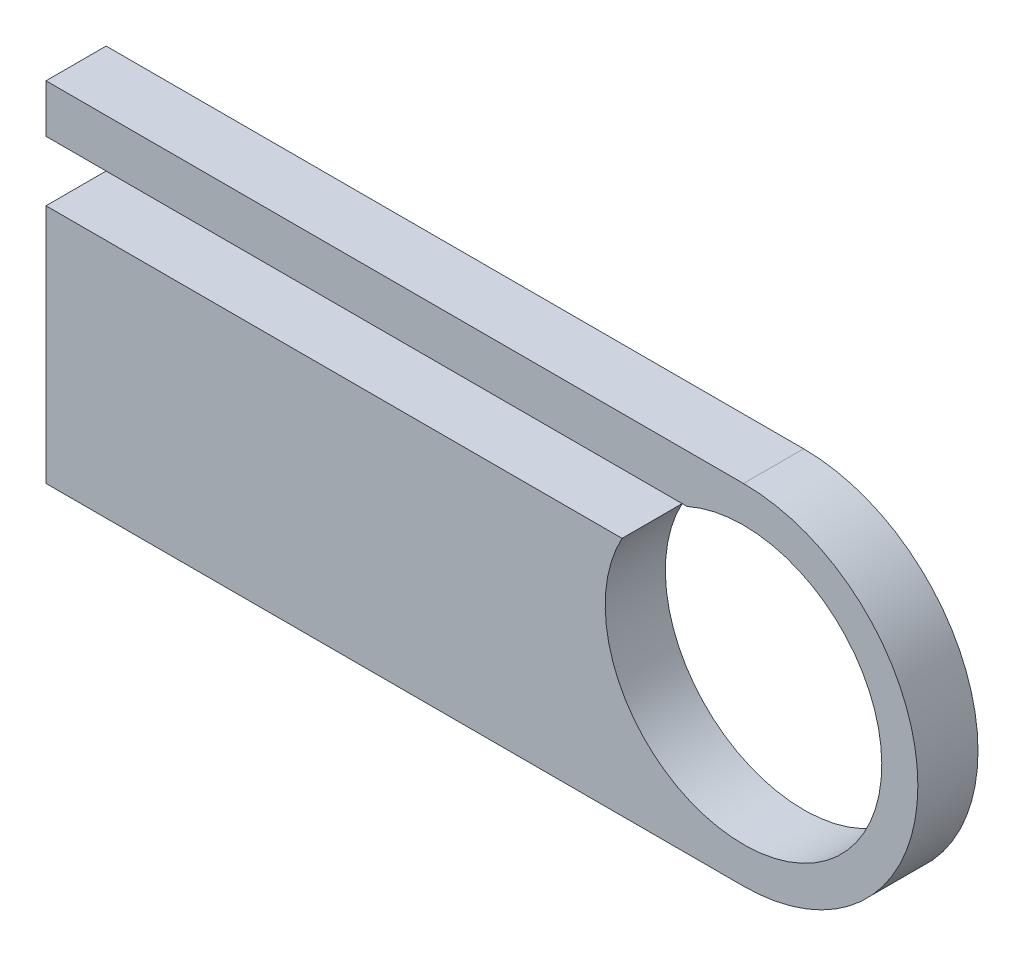
ISO-10303-21;
HEADER;
FILE_DESCRIPTION(('STEP AP214'),'2;1');
FILE_NAME('part.step','',(''),(''),'','','');
FILE_SCHEMA(('AUTOMOTIVE_DESIGN { 1 0 10303 214 1 1 1 1 }'));
ENDSEC;
DATA;
#1=APPLICATION_CONTEXT('core data for automotive mechanical design processes');
#2=APPLICATION_PROTOCOL_DEFINITION('international standard','automotive_design',2000,#1);
#3=PRODUCT_CONTEXT('',#1,'mechanical');
#4=PRODUCT('Part','Part','',(#3));
#5=PRODUCT_RELATED_PRODUCT_CATEGORY('part','',(#4));
#6=PRODUCT_DEFINITION_FORMATION('','',#4);
#7=PRODUCT_DEFINITION_CONTEXT('part definition',#1,'design');
#8=PRODUCT_DEFINITION('design','',#6,#7);
#9=PRODUCT_DEFINITION_SHAPE('','',#8);
#10=(LENGTH_UNIT() NAMED_UNIT(*) SI_UNIT(.MILLI.,.METRE.));
#11=(NAMED_UNIT(*) PLANE_ANGLE_UNIT() SI_UNIT($,.RADIAN.));
#12=(NAMED_UNIT(*) SI_UNIT($,.STERADIAN.) SOLID_ANGLE_UNIT());
#13=UNCERTAINTY_MEASURE_WITH_UNIT(LENGTH_MEASURE(1.E-05),#10,'distance_accuracy_value','');
#14=(GEOMETRIC_REPRESENTATION_CONTEXT(3) GLOBAL_UNCERTAINTY_ASSIGNED_CONTEXT((#13)) GLOBAL_UNIT_ASSIGNED_CONTEXT((#10,
#11,#12)) REPRESENTATION_CONTEXT('',''));
#15=CARTESIAN_POINT('',(0.,0.,0.));
#16=DIRECTION('',(0.,0.,1.));
#17=DIRECTION('',(1.,0.,0.));
#18=AXIS2_PLACEMENT_3D('',#15,#16,#17);
#19=CARTESIAN_POINT('',(0.,0.,5.));
#20=DIRECTION('',(0.,1.,0.));
#21=DIRECTION('',(0.,0.,1.));
#22=AXIS2_PLACEMENT_3D('',#19,#20,#21);
#23=PLANE('',#22);
#24=DIRECTION('',(1.,0.,0.));
#25=VECTOR('',#24,1.);
#26=CARTESIAN_POINT('',(0.,0.,0.));
#27=LINE('',#26,#25);
#28=CARTESIAN_POINT('',(0.,0.,0.));
#29=VERTEX_POINT('',#28);
#30=CARTESIAN_POINT('',(53.3095842401766,0.,0.));
#31=VERTEX_POINT('',#30);
#32=EDGE_CURVE('E129',#29,#31,#27,.T.);
#33=ORIENTED_EDGE('',*,*,#32,.T.);
#34=DIRECTION('',(0.,0.,-1.));
#35=VECTOR('',#34,1.);
#36=CARTESIAN_POINT('',(53.3095842401766,0.,5.));
#37=LINE('',#36,#35);
#38=CARTESIAN_POINT('',(53.3095842401766,0.,5.));
#39=VERTEX_POINT('',#38);
#40=EDGE_CURVE('E11',#39,#31,#37,.T.);
#41=ORIENTED_EDGE('',*,*,#40,.F.);
#42=DIRECTION('',(1.,0.,0.));
#43=VECTOR('',#42,1.);
#44=CARTESIAN_POINT('',(0.,0.,5.));
#45=LINE('',#44,#43);
#46=CARTESIAN_POINT('',(0.,0.,5.));
#47=VERTEX_POINT('',#46);
#48=EDGE_CURVE('E143',#47,#39,#45,.T.);
#49=ORIENTED_EDGE('',*,*,#48,.F.);
#50=DIRECTION('',(0.,0.,-1.));
#51=VECTOR('',#50,1.);
#52=CARTESIAN_POINT('',(0.,0.,5.));
#53=LINE('',#52,#51);
#54=EDGE_CURVE('E125',#47,#29,#53,.T.);
#55=ORIENTED_EDGE('',*,*,#54,.T.);
#56=EDGE_LOOP('',(#33,#41,#49,#55));
#57=FACE_BOUND('',#56,.T.);
#58=ADVANCED_FACE('F33',(#57),#23,.F.);
#59=CARTESIAN_POINT('',(58.,-10.5,5.));
#60=DIRECTION('',(0.,0.,-1.));
#61=DIRECTION('',(-1.,0.,0.));
#62=AXIS2_PLACEMENT_3D('',#59,#60,#61);
#63=CYLINDRICAL_SURFACE('',#62,11.5);
#64=CARTESIAN_POINT('',(58.,-10.5,0.));
#65=DIRECTION('',(0.,0.,-1.));
#66=DIRECTION('',(-1.,0.,0.));
#67=AXIS2_PLACEMENT_3D('',#64,#65,#66);
#68=CIRCLE('',#67,11.5);
#69=CARTESIAN_POINT('',(47.9004950616379,-4.99999999999999,0.));
#70=VERTEX_POINT('',#69);
#71=EDGE_CURVE('E132',#31,#70,#68,.T.);
#72=ORIENTED_EDGE('',*,*,#71,.T.);
#73=DIRECTION('',(0.,0.,-1.));
#74=VECTOR('',#73,1.);
#75=CARTESIAN_POINT('',(47.9004950616379,-4.99999999999999,5.));
#76=LINE('',#75,#74);
#77=CARTESIAN_POINT('',(47.9004950616379,-4.99999999999999,5.));
#78=VERTEX_POINT('',#77);
#79=EDGE_CURVE('E41',#78,#70,#76,.T.);
#80=ORIENTED_EDGE('',*,*,#79,.F.);
#81=CARTESIAN_POINT('',(58.,-10.5,5.));
#82=DIRECTION('',(0.,0.,-1.));
#83=DIRECTION('',(-1.,0.,0.));
#84=AXIS2_PLACEMENT_3D('',#81,#82,#83);
#85=CIRCLE('',#84,11.5);
#86=EDGE_CURVE('E92',#39,#78,#85,.T.);
#87=ORIENTED_EDGE('',*,*,#86,.F.);
#88=ORIENTED_EDGE('',*,*,#40,.T.);
#89=EDGE_LOOP('',(#72,#80,#87,#88));
#90=FACE_BOUND('',#89,.T.);
#91=ADVANCED_FACE('F178',(#90),#63,.F.);
#92=CARTESIAN_POINT('',(47.9004950616379,-4.99999999999999,5.));
#93=DIRECTION('',(0.,-1.,0.));
#94=DIRECTION('',(1.,0.,0.));
#95=AXIS2_PLACEMENT_3D('',#92,#93,#94);
#96=PLANE('',#95);
#97=DIRECTION('',(-1.,0.,0.));
#98=VECTOR('',#97,1.);
#99=CARTESIAN_POINT('',(47.9004950616379,-4.99999999999999,0.));
#100=LINE('',#99,#98);
#101=CARTESIAN_POINT('',(0.,-5.,0.));
#102=VERTEX_POINT('',#101);
#103=EDGE_CURVE('E134',#70,#102,#100,.T.);
#104=ORIENTED_EDGE('',*,*,#103,.T.);
#105=DIRECTION('',(0.,0.,-1.));
#106=VECTOR('',#105,1.);
#107=CARTESIAN_POINT('',(0.,-5.,5.));
#108=LINE('',#107,#106);
#109=CARTESIAN_POINT('',(0.,-5.,5.));
#110=VERTEX_POINT('',#109);
#111=EDGE_CURVE('E150',#110,#102,#108,.T.);
#112=ORIENTED_EDGE('',*,*,#111,.F.);
#113=DIRECTION('',(-1.,0.,0.));
#114=VECTOR('',#113,1.);
#115=CARTESIAN_POINT('',(47.9004950616379,-4.99999999999999,5.));
#116=LINE('',#115,#114);
#117=EDGE_CURVE('E158',#78,#110,#116,.T.);
#118=ORIENTED_EDGE('',*,*,#117,.F.);
#119=ORIENTED_EDGE('',*,*,#79,.T.);
#120=EDGE_LOOP('',(#104,#112,#118,#119));
#121=FACE_BOUND('',#120,.T.);
#122=ADVANCED_FACE('F156',(#121),#96,.F.);
#123=CARTESIAN_POINT('',(0.,-5.,5.));
#124=DIRECTION('',(1.,0.,0.));
#125=DIRECTION('',(0.,1.,0.));
#126=AXIS2_PLACEMENT_3D('',#123,#124,#125);
#127=PLANE('',#126);
#128=DIRECTION('',(0.,-1.,0.));
#129=VECTOR('',#128,1.);
#130=CARTESIAN_POINT('',(0.,-5.,0.));
#131=LINE('',#130,#129);
#132=CARTESIAN_POINT('',(0.,-25.,0.));
#133=VERTEX_POINT('',#132);
#134=EDGE_CURVE('E136',#102,#133,#131,.T.);
#135=ORIENTED_EDGE('',*,*,#134,.T.);
#136=DIRECTION('',(0.,0.,-1.));
#137=VECTOR('',#136,1.);
#138=CARTESIAN_POINT('',(0.,-25.,5.));
#139=LINE('',#138,#137);
#140=CARTESIAN_POINT('',(0.,-25.,5.));
#141=VERTEX_POINT('',#140);
#142=EDGE_CURVE('E147',#141,#133,#139,.T.);
#143=ORIENTED_EDGE('',*,*,#142,.F.);
#144=DIRECTION('',(0.,-1.,0.));
#145=VECTOR('',#144,1.);
#146=CARTESIAN_POINT('',(0.,-5.,5.));
#147=LINE('',#146,#145);
#148=EDGE_CURVE('E170',#110,#141,#147,.T.);
#149=ORIENTED_EDGE('',*,*,#148,.F.);
#150=ORIENTED_EDGE('',*,*,#111,.T.);
#151=EDGE_LOOP('',(#135,#143,#149,#150));
#152=FACE_BOUND('',#151,.T.);
#153=ADVANCED_FACE('F166',(#152),#127,.F.);
#154=CARTESIAN_POINT('',(0.,-25.,5.));
#155=DIRECTION('',(0.,1.,0.));
#156=DIRECTION('',(0.,0.,1.));
#157=AXIS2_PLACEMENT_3D('',#154,#155,#156);
#158=PLANE('',#157);
#159=DIRECTION('',(1.,0.,0.));
#160=VECTOR('',#159,1.);
#161=CARTESIAN_POINT('',(0.,-25.,0.));
#162=LINE('',#161,#160);
#163=CARTESIAN_POINT('',(58.,-25.,0.));
#164=VERTEX_POINT('',#163);
#165=EDGE_CURVE('E138',#133,#164,#162,.T.);
#166=ORIENTED_EDGE('',*,*,#165,.T.);
#167=DIRECTION('',(0.,0.,-1.));
#168=VECTOR('',#167,1.);
#169=CARTESIAN_POINT('',(58.,-25.,5.));
#170=LINE('',#169,#168);
#171=CARTESIAN_POINT('',(58.,-25.,5.));
#172=VERTEX_POINT('',#171);
#173=EDGE_CURVE('E120',#172,#164,#170,.T.);
#174=ORIENTED_EDGE('',*,*,#173,.F.);
#175=DIRECTION('',(1.,0.,0.));
#176=VECTOR('',#175,1.);
#177=CARTESIAN_POINT('',(0.,-25.,5.));
#178=LINE('',#177,#176);
#179=EDGE_CURVE('E111',#141,#172,#178,.T.);
#180=ORIENTED_EDGE('',*,*,#179,.F.);
#181=ORIENTED_EDGE('',*,*,#142,.T.);
#182=EDGE_LOOP('',(#166,#174,#180,#181));
#183=FACE_BOUND('',#182,.T.);
#184=ADVANCED_FACE('F169',(#183),#158,.F.);
#185=CARTESIAN_POINT('',(58.,-10.5,5.));
#186=DIRECTION('',(0.,0.,-1.));
#187=DIRECTION('',(-1.,0.,0.));
#188=AXIS2_PLACEMENT_3D('',#185,#186,#187);
#189=CYLINDRICAL_SURFACE('',#188,14.5);
#190=CARTESIAN_POINT('',(58.,-10.5,0.));
#191=DIRECTION('',(0.,0.,1.));
#192=DIRECTION('',(-1.,0.,0.));
#193=AXIS2_PLACEMENT_3D('',#190,#191,#192);
#194=CIRCLE('',#193,14.5);
#195=CARTESIAN_POINT('',(58.,4.,0.));
#196=VERTEX_POINT('',#195);
#197=EDGE_CURVE('E119',#164,#196,#194,.T.);
#198=ORIENTED_EDGE('',*,*,#197,.T.);
#199=DIRECTION('',(0.,0.,-1.));
#200=VECTOR('',#199,1.);
#201=CARTESIAN_POINT('',(58.,4.,5.));
#202=LINE('',#201,#200);
#203=CARTESIAN_POINT('',(58.,4.,5.));
#204=VERTEX_POINT('',#203);
#205=EDGE_CURVE('E116',#204,#196,#202,.T.);
#206=ORIENTED_EDGE('',*,*,#205,.F.);
#207=CARTESIAN_POINT('',(58.,-10.5,5.));
#208=DIRECTION('',(0.,0.,1.));
#209=DIRECTION('',(-1.,0.,0.));
#210=AXIS2_PLACEMENT_3D('',#207,#208,#209);
#211=CIRCLE('',#210,14.5);
#212=EDGE_CURVE('E105',#172,#204,#211,.T.);
#213=ORIENTED_EDGE('',*,*,#212,.F.);
#214=ORIENTED_EDGE('',*,*,#173,.T.);
#215=EDGE_LOOP('',(#198,#206,#213,#214));
#216=FACE_BOUND('',#215,.T.);
#217=ADVANCED_FACE('F117',(#216),#189,.T.);
#218=CARTESIAN_POINT('',(0.,4.,5.));
#219=DIRECTION('',(0.,-1.,0.));
#220=DIRECTION('',(0.,0.,-1.));
#221=AXIS2_PLACEMENT_3D('',#218,#219,#220);
#222=PLANE('',#221);
#223=DIRECTION('',(-1.,0.,0.));
#224=VECTOR('',#223,1.);
#225=CARTESIAN_POINT('',(0.,4.,0.));
#226=LINE('',#225,#224);
#227=CARTESIAN_POINT('',(0.,4.,0.));
#228=VERTEX_POINT('',#227);
#229=EDGE_CURVE('E78',#196,#228,#226,.T.);
#230=ORIENTED_EDGE('',*,*,#229,.T.);
#231=DIRECTION('',(0.,0.,-1.));
#232=VECTOR('',#231,1.);
#233=CARTESIAN_POINT('',(0.,4.,5.));
#234=LINE('',#233,#232);
#235=CARTESIAN_POINT('',(0.,4.,5.));
#236=VERTEX_POINT('',#235);
#237=EDGE_CURVE('E121',#236,#228,#234,.T.);
#238=ORIENTED_EDGE('',*,*,#237,.F.);
#239=DIRECTION('',(-1.,0.,0.));
#240=VECTOR('',#239,1.);
#241=CARTESIAN_POINT('',(0.,4.,5.));
#242=LINE('',#241,#240);
#243=EDGE_CURVE('E109',#204,#236,#242,.T.);
#244=ORIENTED_EDGE('',*,*,#243,.F.);
#245=ORIENTED_EDGE('',*,*,#205,.T.);
#246=EDGE_LOOP('',(#230,#238,#244,#245));
#247=FACE_BOUND('',#246,.T.);
#248=ADVANCED_FACE('F123',(#247),#222,.F.);
#249=CARTESIAN_POINT('',(0.,0.,5.));
#250=DIRECTION('',(1.,0.,0.));
#251=DIRECTION('',(0.,0.,-1.));
#252=AXIS2_PLACEMENT_3D('',#249,#250,#251);
#253=PLANE('',#252);
#254=DIRECTION('',(0.,-1.,0.));
#255=VECTOR('',#254,1.);
#256=CARTESIAN_POINT('',(0.,0.,0.));
#257=LINE('',#256,#255);
#258=EDGE_CURVE('E84',#228,#29,#257,.T.);
#259=ORIENTED_EDGE('',*,*,#258,.T.);
#260=ORIENTED_EDGE('',*,*,#54,.F.);
#261=DIRECTION('',(0.,-1.,0.));
#262=VECTOR('',#261,1.);
#263=CARTESIAN_POINT('',(0.,0.,5.));
#264=LINE('',#263,#262);
#265=EDGE_CURVE('E49',#236,#47,#264,.T.);
#266=ORIENTED_EDGE('',*,*,#265,.F.);
#267=ORIENTED_EDGE('',*,*,#237,.T.);
#268=EDGE_LOOP('',(#259,#260,#266,#267));
#269=FACE_BOUND('',#268,.T.);
#270=ADVANCED_FACE('F194',(#269),#253,.F.);
#271=CARTESIAN_POINT('',(58.,-10.5,5.));
#272=DIRECTION('',(0.,0.,-1.));
#273=DIRECTION('',(-1.,0.,0.));
#274=AXIS2_PLACEMENT_3D('',#271,#272,#273);
#275=PLANE('',#274);
#276=ORIENTED_EDGE('',*,*,#48,.T.);
#277=ORIENTED_EDGE('',*,*,#86,.T.);
#278=ORIENTED_EDGE('',*,*,#117,.T.);
#279=ORIENTED_EDGE('',*,*,#148,.T.);
#280=ORIENTED_EDGE('',*,*,#179,.T.);
#281=ORIENTED_EDGE('',*,*,#212,.T.);
#282=ORIENTED_EDGE('',*,*,#243,.T.);
#283=ORIENTED_EDGE('',*,*,#265,.T.);
#284=EDGE_LOOP('',(#276,#277,#278,#279,#280,#281,#282,#283));
#285=FACE_BOUND('',#284,.T.);
#286=ADVANCED_FACE('F107',(#285),#275,.F.);
#287=CARTESIAN_POINT('',(58.,-10.5,0.));
#288=DIRECTION('',(0.,0.,-1.));
#289=DIRECTION('',(-1.,0.,0.));
#290=AXIS2_PLACEMENT_3D('',#287,#288,#289);
#291=PLANE('',#290);
#292=ORIENTED_EDGE('',*,*,#32,.F.);
#293=ORIENTED_EDGE('',*,*,#258,.F.);
#294=ORIENTED_EDGE('',*,*,#229,.F.);
#295=ORIENTED_EDGE('',*,*,#197,.F.);
#296=ORIENTED_EDGE('',*,*,#165,.F.);
#297=ORIENTED_EDGE('',*,*,#134,.F.);
#298=ORIENTED_EDGE('',*,*,#103,.F.);
#299=ORIENTED_EDGE('',*,*,#71,.F.);
#300=EDGE_LOOP('',(#292,#293,#294,#295,#296,#297,#298,#299));
#301=FACE_BOUND('',#300,.T.);
#302=ADVANCED_FACE('F162',(#301),#291,.T.);
#303=CLOSED_SHELL('',(#58,#91,#122,#153,#184,#217,#248,#270,#286,#302));
#304=MANIFOLD_SOLID_BREP('B2',#303);
#305=ADVANCED_BREP_SHAPE_REPRESENTATION('',(#18,#304),#14);
#306=SHAPE_DEFINITION_REPRESENTATION(#9,#305);
ENDSEC;
END-ISO-10303-21;
